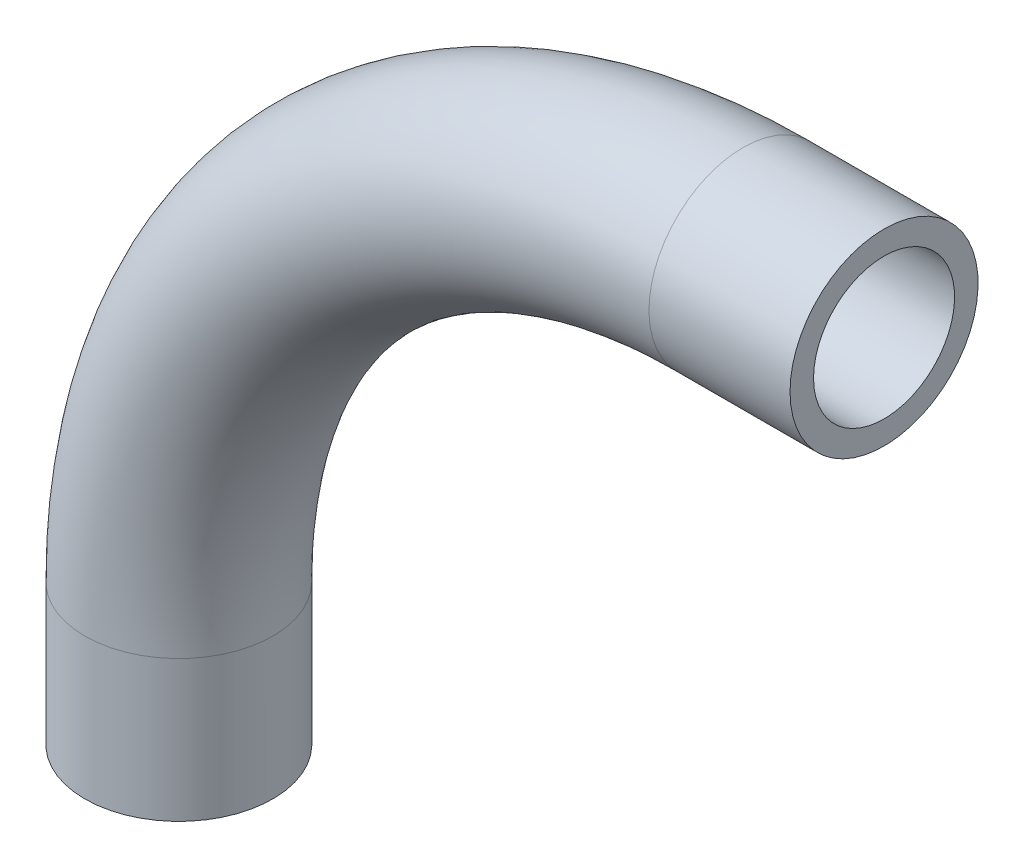
ISO-10303-21;
HEADER;
FILE_DESCRIPTION(('STEP AP214'),'2;1');
FILE_NAME('part.step','',(''),(''),'','','');
FILE_SCHEMA(('AUTOMOTIVE_DESIGN { 1 0 10303 214 1 1 1 1 }'));
ENDSEC;
DATA;
#1=APPLICATION_CONTEXT('core data for automotive mechanical design processes');
#2=APPLICATION_PROTOCOL_DEFINITION('international standard','automotive_design',2000,#1);
#3=PRODUCT_CONTEXT('',#1,'mechanical');
#4=PRODUCT('Part','Part','',(#3));
#5=PRODUCT_RELATED_PRODUCT_CATEGORY('part','',(#4));
#6=PRODUCT_DEFINITION_FORMATION('','',#4);
#7=PRODUCT_DEFINITION_CONTEXT('part definition',#1,'design');
#8=PRODUCT_DEFINITION('design','',#6,#7);
#9=PRODUCT_DEFINITION_SHAPE('','',#8);
#10=(LENGTH_UNIT() NAMED_UNIT(*) SI_UNIT(.MILLI.,.METRE.));
#11=(NAMED_UNIT(*) PLANE_ANGLE_UNIT() SI_UNIT($,.RADIAN.));
#12=(NAMED_UNIT(*) SI_UNIT($,.STERADIAN.) SOLID_ANGLE_UNIT());
#13=UNCERTAINTY_MEASURE_WITH_UNIT(LENGTH_MEASURE(1.E-05),#10,'distance_accuracy_value','');
#14=(GEOMETRIC_REPRESENTATION_CONTEXT(3) GLOBAL_UNCERTAINTY_ASSIGNED_CONTEXT((#13)) GLOBAL_UNIT_ASSIGNED_CONTEXT((#10,
#11,#12)) REPRESENTATION_CONTEXT('',''));
#15=CARTESIAN_POINT('',(0.,0.,0.));
#16=DIRECTION('',(0.,0.,1.));
#17=DIRECTION('',(1.,0.,0.));
#18=AXIS2_PLACEMENT_3D('',#15,#16,#17);
#19=CARTESIAN_POINT('',(0.,0.,0.));
#20=DIRECTION('',(0.,1.,0.));
#21=DIRECTION('',(0.,0.,1.));
#22=AXIS2_PLACEMENT_3D('',#19,#20,#21);
#23=CYLINDRICAL_SURFACE('',#22,4.);
#24=CARTESIAN_POINT('',(0.,5.99999999999998,0.));
#25=DIRECTION('',(0.,1.,0.));
#26=DIRECTION('',(0.,0.,1.));
#27=AXIS2_PLACEMENT_3D('',#24,#25,#26);
#28=CIRCLE('',#27,4.);
#29=CARTESIAN_POINT('',(-4.,5.99999999999998,0.));
#30=VERTEX_POINT('',#29);
#31=EDGE_CURVE('E80',#30,#30,#28,.T.);
#32=ORIENTED_EDGE('',*,*,#31,.F.);
#33=EDGE_LOOP('',(#32));
#34=FACE_BOUND('',#33,.T.);
#35=CARTESIAN_POINT('',(0.,0.,0.));
#36=DIRECTION('',(0.,1.,0.));
#37=DIRECTION('',(0.,0.,1.));
#38=AXIS2_PLACEMENT_3D('',#35,#36,#37);
#39=CIRCLE('',#38,4.);
#40=CARTESIAN_POINT('',(0.,0.,4.));
#41=VERTEX_POINT('',#40);
#42=EDGE_CURVE('E49',#41,#41,#39,.T.);
#43=ORIENTED_EDGE('',*,*,#42,.T.);
#44=EDGE_LOOP('',(#43));
#45=FACE_BOUND('',#44,.T.);
#46=ADVANCED_FACE('F34',(#34,#45),#23,.T.);
#47=CARTESIAN_POINT('',(24.,5.99999999999998,0.));
#48=DIRECTION('',(0.,0.,-1.));
#49=DIRECTION('',(-1.,0.,0.));
#50=AXIS2_PLACEMENT_3D('',#47,#48,#49);
#51=TOROIDAL_SURFACE('',#50,24.,4.);
#52=CARTESIAN_POINT('',(24.,30.,0.));
#53=DIRECTION('',(1.,0.,0.));
#54=DIRECTION('',(0.,0.,1.));
#55=AXIS2_PLACEMENT_3D('',#52,#53,#54);
#56=CIRCLE('',#55,4.);
#57=CARTESIAN_POINT('',(24.,34.,0.));
#58=VERTEX_POINT('',#57);
#59=EDGE_CURVE('E38',#58,#58,#56,.T.);
#60=CARTESIAN_POINT('',(24.,5.99999999999998,0.));
#61=DIRECTION('',(0.,0.,-1.));
#62=DIRECTION('',(-1.,0.,0.));
#63=AXIS2_PLACEMENT_3D('',#60,#61,#62);
#64=CIRCLE('',#63,28.);
#65=EDGE_CURVE('',#30,#58,#64,.T.);
#66=ORIENTED_EDGE('',*,*,#31,.T.);
#67=ORIENTED_EDGE('',*,*,#59,.F.);
#68=ORIENTED_EDGE('',*,*,#65,.T.);
#69=ORIENTED_EDGE('',*,*,#65,.F.);
#70=EDGE_LOOP('',(#66,#68,#67,#69));
#71=FACE_BOUND('',#70,.T.);
#72=ADVANCED_FACE('F88',(#71),#51,.T.);
#73=CARTESIAN_POINT('',(24.,30.,0.));
#74=DIRECTION('',(1.,0.,0.));
#75=DIRECTION('',(0.,1.,0.));
#76=AXIS2_PLACEMENT_3D('',#73,#74,#75);
#77=CYLINDRICAL_SURFACE('',#76,4.);
#78=CARTESIAN_POINT('',(30.,30.,0.));
#79=DIRECTION('',(1.,0.,0.));
#80=DIRECTION('',(0.,0.,1.));
#81=AXIS2_PLACEMENT_3D('',#78,#79,#80);
#82=CIRCLE('',#81,4.);
#83=CARTESIAN_POINT('',(30.,30.,4.));
#84=VERTEX_POINT('',#83);
#85=EDGE_CURVE('E54',#84,#84,#82,.T.);
#86=ORIENTED_EDGE('',*,*,#85,.F.);
#87=EDGE_LOOP('',(#86));
#88=FACE_BOUND('',#87,.T.);
#89=ORIENTED_EDGE('',*,*,#59,.T.);
#90=EDGE_LOOP('',(#89));
#91=FACE_BOUND('',#90,.T.);
#92=ADVANCED_FACE('F36',(#88,#91),#77,.T.);
#93=CARTESIAN_POINT('',(0.,0.,0.));
#94=DIRECTION('',(0.,1.,0.));
#95=DIRECTION('',(0.,0.,1.));
#96=AXIS2_PLACEMENT_3D('',#93,#94,#95);
#97=PLANE('',#96);
#98=CARTESIAN_POINT('',(0.,0.,0.));
#99=DIRECTION('',(0.,1.,0.));
#100=DIRECTION('',(0.,0.,1.));
#101=AXIS2_PLACEMENT_3D('',#98,#99,#100);
#102=CIRCLE('',#101,3.);
#103=CARTESIAN_POINT('',(0.,0.,3.));
#104=VERTEX_POINT('',#103);
#105=EDGE_CURVE('E75',#104,#104,#102,.F.);
#106=ORIENTED_EDGE('',*,*,#105,.F.);
#107=EDGE_LOOP('',(#106));
#108=FACE_BOUND('',#107,.T.);
#109=ORIENTED_EDGE('',*,*,#42,.F.);
#110=EDGE_LOOP('',(#109));
#111=FACE_BOUND('',#110,.T.);
#112=ADVANCED_FACE('F94',(#108,#111),#97,.F.);
#113=CARTESIAN_POINT('',(30.,30.,0.));
#114=DIRECTION('',(1.,0.,0.));
#115=DIRECTION('',(0.,0.,1.));
#116=AXIS2_PLACEMENT_3D('',#113,#114,#115);
#117=PLANE('',#116);
#118=CARTESIAN_POINT('',(30.,30.,0.));
#119=DIRECTION('',(1.,0.,0.));
#120=DIRECTION('',(0.,0.,1.));
#121=AXIS2_PLACEMENT_3D('',#118,#119,#120);
#122=CIRCLE('',#121,3.);
#123=CARTESIAN_POINT('',(30.,30.,3.));
#124=VERTEX_POINT('',#123);
#125=EDGE_CURVE('E11',#124,#124,#122,.F.);
#126=ORIENTED_EDGE('',*,*,#125,.T.);
#127=EDGE_LOOP('',(#126));
#128=FACE_BOUND('',#127,.T.);
#129=ORIENTED_EDGE('',*,*,#85,.T.);
#130=EDGE_LOOP('',(#129));
#131=FACE_BOUND('',#130,.T.);
#132=ADVANCED_FACE('F61',(#128,#131),#117,.T.);
#133=CARTESIAN_POINT('',(0.,0.,0.));
#134=DIRECTION('',(0.,1.,0.));
#135=DIRECTION('',(0.,0.,1.));
#136=AXIS2_PLACEMENT_3D('',#133,#134,#135);
#137=CYLINDRICAL_SURFACE('',#136,3.);
#138=CARTESIAN_POINT('',(0.,5.99999999999998,0.));
#139=DIRECTION('',(0.,1.,0.));
#140=DIRECTION('',(0.,0.,1.));
#141=AXIS2_PLACEMENT_3D('',#138,#139,#140);
#142=CIRCLE('',#141,3.);
#143=CARTESIAN_POINT('',(-3.,5.99999999999998,0.));
#144=VERTEX_POINT('',#143);
#145=EDGE_CURVE('E72',#144,#144,#142,.F.);
#146=ORIENTED_EDGE('',*,*,#145,.F.);
#147=EDGE_LOOP('',(#146));
#148=FACE_BOUND('',#147,.T.);
#149=ORIENTED_EDGE('',*,*,#105,.T.);
#150=EDGE_LOOP('',(#149));
#151=FACE_BOUND('',#150,.T.);
#152=ADVANCED_FACE('F102',(#148,#151),#137,.F.);
#153=CARTESIAN_POINT('',(24.,5.99999999999998,0.));
#154=DIRECTION('',(0.,0.,-1.));
#155=DIRECTION('',(-1.,0.,0.));
#156=AXIS2_PLACEMENT_3D('',#153,#154,#155);
#157=TOROIDAL_SURFACE('',#156,24.,3.);
#158=CARTESIAN_POINT('',(24.,30.,0.));
#159=DIRECTION('',(1.,0.,0.));
#160=DIRECTION('',(0.,0.,1.));
#161=AXIS2_PLACEMENT_3D('',#158,#159,#160);
#162=CIRCLE('',#161,3.);
#163=CARTESIAN_POINT('',(24.,33.,0.));
#164=VERTEX_POINT('',#163);
#165=EDGE_CURVE('E43',#164,#164,#162,.F.);
#166=CARTESIAN_POINT('',(24.,5.99999999999998,0.));
#167=DIRECTION('',(0.,0.,-1.));
#168=DIRECTION('',(-1.,0.,0.));
#169=AXIS2_PLACEMENT_3D('',#166,#167,#168);
#170=CIRCLE('',#169,27.);
#171=EDGE_CURVE('',#144,#164,#170,.T.);
#172=ORIENTED_EDGE('',*,*,#145,.T.);
#173=ORIENTED_EDGE('',*,*,#165,.F.);
#174=ORIENTED_EDGE('',*,*,#171,.T.);
#175=ORIENTED_EDGE('',*,*,#171,.F.);
#176=EDGE_LOOP('',(#172,#174,#173,#175));
#177=FACE_BOUND('',#176,.T.);
#178=ADVANCED_FACE('F67',(#177),#157,.F.);
#179=CARTESIAN_POINT('',(24.,30.,0.));
#180=DIRECTION('',(1.,0.,0.));
#181=DIRECTION('',(0.,1.,0.));
#182=AXIS2_PLACEMENT_3D('',#179,#180,#181);
#183=CYLINDRICAL_SURFACE('',#182,3.);
#184=ORIENTED_EDGE('',*,*,#125,.F.);
#185=EDGE_LOOP('',(#184));
#186=FACE_BOUND('',#185,.T.);
#187=ORIENTED_EDGE('',*,*,#165,.T.);
#188=EDGE_LOOP('',(#187));
#189=FACE_BOUND('',#188,.T.);
#190=ADVANCED_FACE('F64',(#186,#189),#183,.F.);
#191=CLOSED_SHELL('',(#46,#72,#92,#112,#132,#152,#178,#190));
#192=MANIFOLD_SOLID_BREP('B2',#191);
#193=ADVANCED_BREP_SHAPE_REPRESENTATION('',(#18,#192),#14);
#194=SHAPE_DEFINITION_REPRESENTATION(#9,#193);
ENDSEC;
END-ISO-10303-21;
